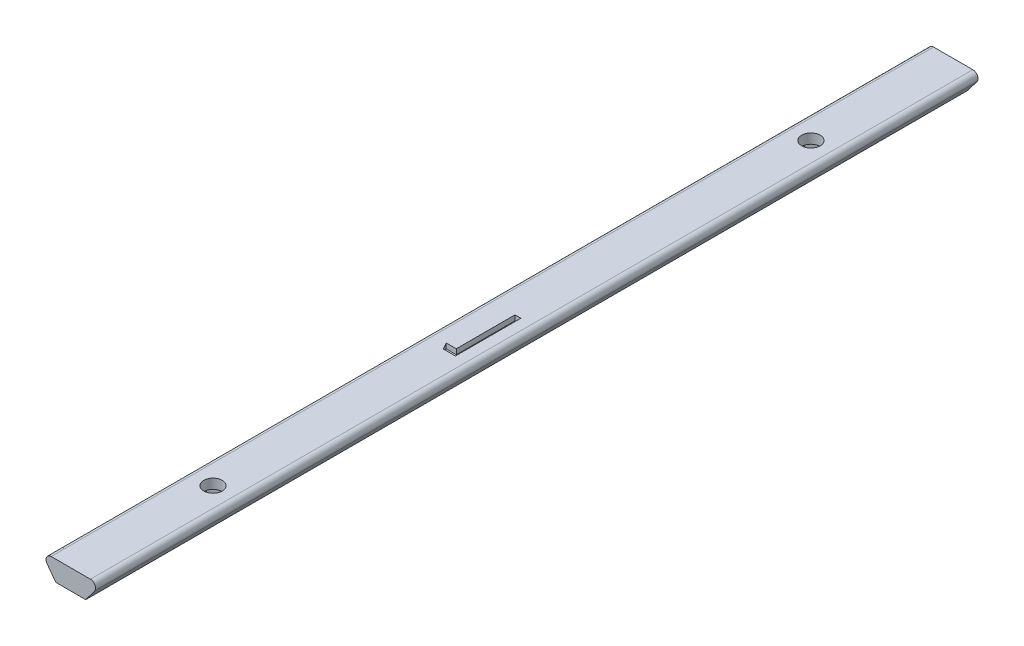
ISO-10303-21;
HEADER;
FILE_DESCRIPTION(('STEP AP214'),'2;1');
FILE_NAME('part.step','',(''),(''),'','','');
FILE_SCHEMA(('AUTOMOTIVE_DESIGN { 1 0 10303 214 1 1 1 1 }'));
ENDSEC;
DATA;
#1=APPLICATION_CONTEXT('core data for automotive mechanical design processes');
#2=APPLICATION_PROTOCOL_DEFINITION('international standard','automotive_design',2000,#1);
#3=PRODUCT_CONTEXT('',#1,'mechanical');
#4=PRODUCT('Part','Part','',(#3));
#5=PRODUCT_RELATED_PRODUCT_CATEGORY('part','',(#4));
#6=PRODUCT_DEFINITION_FORMATION('','',#4);
#7=PRODUCT_DEFINITION_CONTEXT('part definition',#1,'design');
#8=PRODUCT_DEFINITION('design','',#6,#7);
#9=PRODUCT_DEFINITION_SHAPE('','',#8);
#10=(LENGTH_UNIT() NAMED_UNIT(*) SI_UNIT(.MILLI.,.METRE.));
#11=(NAMED_UNIT(*) PLANE_ANGLE_UNIT() SI_UNIT($,.RADIAN.));
#12=(NAMED_UNIT(*) SI_UNIT($,.STERADIAN.) SOLID_ANGLE_UNIT());
#13=UNCERTAINTY_MEASURE_WITH_UNIT(LENGTH_MEASURE(1.E-05),#10,'distance_accuracy_value','');
#14=(GEOMETRIC_REPRESENTATION_CONTEXT(3) GLOBAL_UNCERTAINTY_ASSIGNED_CONTEXT((#13)) GLOBAL_UNIT_ASSIGNED_CONTEXT((#10,
#11,#12)) REPRESENTATION_CONTEXT('',''));
#15=CARTESIAN_POINT('',(0.,0.,0.));
#16=DIRECTION('',(0.,0.,1.));
#17=DIRECTION('',(1.,0.,0.));
#18=AXIS2_PLACEMENT_3D('',#15,#16,#17);
#19=CARTESIAN_POINT('',(0.,0.,171.2));
#20=DIRECTION('',(0.,1.,0.));
#21=DIRECTION('',(0.,0.,1.));
#22=AXIS2_PLACEMENT_3D('',#19,#20,#21);
#23=PLANE('',#22);
#24=DIRECTION('',(0.,0.,-1.));
#25=VECTOR('',#24,1.);
#26=CARTESIAN_POINT('',(5.8,0.,171.2));
#27=LINE('',#26,#25);
#28=CARTESIAN_POINT('',(5.8,0.,27.5875535955502));
#29=VERTEX_POINT('',#28);
#30=CARTESIAN_POINT('',(5.8,0.,0.));
#31=VERTEX_POINT('',#30);
#32=EDGE_CURVE('E390',#29,#31,#27,.T.);
#33=ORIENTED_EDGE('',*,*,#32,.F.);
#34=DIRECTION('',(0.00858356912603264,0.,0.999963160491955));
#35=VECTOR('',#34,1.);
#36=CARTESIAN_POINT('',(5.78552156018468,0.,25.9008535498542));
#37=LINE('',#36,#35);
#38=CARTESIAN_POINT('',(5.78552156018468,0.,25.9008535498542));
#39=VERTEX_POINT('',#38);
#40=EDGE_CURVE('E58',#39,#29,#37,.T.);
#41=ORIENTED_EDGE('',*,*,#40,.F.);
#42=DIRECTION('',(0.870285284397626,0.,0.492547991327691));
#43=VECTOR('',#42,1.);
#44=CARTESIAN_POINT('',(2.871256789516,0.,24.2514918006395));
#45=LINE('',#44,#43);
#46=CARTESIAN_POINT('',(2.871256789516,0.,24.2514918006395));
#47=VERTEX_POINT('',#46);
#48=EDGE_CURVE('E302',#47,#39,#45,.T.);
#49=ORIENTED_EDGE('',*,*,#48,.F.);
#50=DIRECTION('',(0.861701715271594,0.,-0.507415169164259));
#51=VECTOR('',#50,1.);
#52=CARTESIAN_POINT('',(-0.0142647706686716,0.,25.9506382507852));
#53=LINE('',#52,#51);
#54=CARTESIAN_POINT('',(0.,0.,25.9422384055794));
#55=VERTEX_POINT('',#54);
#56=EDGE_CURVE('E300',#55,#47,#53,.T.);
#57=ORIENTED_EDGE('',*,*,#56,.F.);
#58=DIRECTION('',(0.,0.,-1.));
#59=VECTOR('',#58,1.);
#60=CARTESIAN_POINT('',(0.,0.,171.2));
#61=LINE('',#60,#59);
#62=CARTESIAN_POINT('',(0.,0.,0.));
#63=VERTEX_POINT('',#62);
#64=EDGE_CURVE('E405',#55,#63,#61,.T.);
#65=ORIENTED_EDGE('',*,*,#64,.T.);
#66=DIRECTION('',(1.,0.,0.));
#67=VECTOR('',#66,1.);
#68=CARTESIAN_POINT('',(0.,0.,0.));
#69=LINE('',#68,#67);
#70=EDGE_CURVE('E394',#63,#31,#69,.T.);
#71=ORIENTED_EDGE('',*,*,#70,.T.);
#72=EDGE_LOOP('',(#33,#41,#49,#57,#65,#71));
#73=FACE_BOUND('',#72,.T.);
#74=ADVANCED_FACE('F35',(#73),#23,.F.);
#75=CARTESIAN_POINT('',(2.9,200.,27.6));
#76=DIRECTION('',(0.,-1.,0.));
#77=DIRECTION('',(0.,0.,-1.));
#78=AXIS2_PLACEMENT_3D('',#75,#76,#77);
#79=CYLINDRICAL_SURFACE('',#78,1.8);
#80=CARTESIAN_POINT('',(2.9,3.89999999999999,27.6));
#81=DIRECTION('',(0.,-1.,0.));
#82=DIRECTION('',(0.,0.,-1.));
#83=AXIS2_PLACEMENT_3D('',#80,#81,#82);
#84=CIRCLE('',#83,1.8);
#85=CARTESIAN_POINT('',(2.9,3.89999999999999,25.8));
#86=VERTEX_POINT('',#85);
#87=EDGE_CURVE('E345',#86,#86,#84,.T.);
#88=ORIENTED_EDGE('',*,*,#87,.F.);
#89=EDGE_LOOP('',(#88));
#90=FACE_BOUND('',#89,.T.);
#91=CARTESIAN_POINT('',(2.9,2.,27.6));
#92=DIRECTION('',(0.,-1.,0.));
#93=DIRECTION('',(0.,0.,-1.));
#94=AXIS2_PLACEMENT_3D('',#91,#92,#93);
#95=CIRCLE('',#94,1.8);
#96=CARTESIAN_POINT('',(2.9,2.,25.8));
#97=VERTEX_POINT('',#96);
#98=EDGE_CURVE('E309',#97,#97,#95,.F.);
#99=ORIENTED_EDGE('',*,*,#98,.F.);
#100=EDGE_LOOP('',(#99));
#101=FACE_BOUND('',#100,.T.);
#102=ADVANCED_FACE('F537',(#90,#101),#79,.F.);
#103=DIRECTION('',(-0.870285284397629,0.,-0.492547991327686));
#104=VECTOR('',#103,1.);
#105=CARTESIAN_POINT('',(2.92874321048403,0.,30.9485081993604));
#106=LINE('',#105,#104);
#107=CARTESIAN_POINT('',(2.92874321048403,0.,30.9485081993604));
#108=VERTEX_POINT('',#107);
#109=CARTESIAN_POINT('',(0.0144784398153608,0.,29.2991464501457));
#110=VERTEX_POINT('',#109);
#111=EDGE_CURVE('E295',#108,#110,#106,.T.);
#112=ORIENTED_EDGE('',*,*,#111,.F.);
#113=DIRECTION('',(-0.861701715271594,0.,0.507415169164257));
#114=VECTOR('',#113,1.);
#115=CARTESIAN_POINT('',(5.81426477066871,0.,29.2493617492147));
#116=LINE('',#115,#114);
#117=CARTESIAN_POINT('',(5.8,0.,29.2577615944206));
#118=VERTEX_POINT('',#117);
#119=EDGE_CURVE('E267',#118,#108,#116,.T.);
#120=ORIENTED_EDGE('',*,*,#119,.F.);
#121=CARTESIAN_POINT('',(5.8,0.,143.587553595503));
#122=VERTEX_POINT('',#121);
#123=EDGE_CURVE('E406',#122,#118,#27,.T.);
#124=ORIENTED_EDGE('',*,*,#123,.F.);
#125=DIRECTION('',(0.00858356912603264,0.,0.999963160491955));
#126=VECTOR('',#125,1.);
#127=CARTESIAN_POINT('',(5.78552156018468,0.,141.900853549854));
#128=LINE('',#127,#126);
#129=CARTESIAN_POINT('',(5.78552156018468,0.,141.900853549854));
#130=VERTEX_POINT('',#129);
#131=EDGE_CURVE('E326',#130,#122,#128,.T.);
#132=ORIENTED_EDGE('',*,*,#131,.F.);
#133=DIRECTION('',(0.870285284397626,0.,0.492547991327691));
#134=VECTOR('',#133,1.);
#135=CARTESIAN_POINT('',(2.871256789516,0.,140.25149180064));
#136=LINE('',#135,#134);
#137=CARTESIAN_POINT('',(2.871256789516,0.,140.25149180064));
#138=VERTEX_POINT('',#137);
#139=EDGE_CURVE('E352',#138,#130,#136,.T.);
#140=ORIENTED_EDGE('',*,*,#139,.F.);
#141=DIRECTION('',(0.861701715271594,0.,-0.507415169164259));
#142=VECTOR('',#141,1.);
#143=CARTESIAN_POINT('',(-0.0142647706686716,0.,141.950638250785));
#144=LINE('',#143,#142);
#145=CARTESIAN_POINT('',(0.,0.,141.942238405579));
#146=VERTEX_POINT('',#145);
#147=EDGE_CURVE('E350',#146,#138,#144,.T.);
#148=ORIENTED_EDGE('',*,*,#147,.F.);
#149=CARTESIAN_POINT('',(3.05716128817411E-12,0.,27.6124464052033));
#150=VERTEX_POINT('',#149);
#151=EDGE_CURVE('E411',#146,#150,#61,.T.);
#152=ORIENTED_EDGE('',*,*,#151,.T.);
#153=DIRECTION('',(-0.00858356912603282,0.,-0.999963160491955));
#154=VECTOR('',#153,1.);
#155=CARTESIAN_POINT('',(0.0144784398153608,0.,29.2991464501457));
#156=LINE('',#155,#154);
#157=EDGE_CURVE('E298',#110,#150,#156,.T.);
#158=ORIENTED_EDGE('',*,*,#157,.F.);
#159=EDGE_LOOP('',(#112,#120,#124,#132,#140,#148,#152,#158));
#160=FACE_BOUND('',#159,.T.);
#161=ADVANCED_FACE('F458',(#160),#23,.F.);
#162=CARTESIAN_POINT('',(2.9,200.,143.6));
#163=DIRECTION('',(0.,-1.,0.));
#164=DIRECTION('',(0.,0.,-1.));
#165=AXIS2_PLACEMENT_3D('',#162,#163,#164);
#166=CYLINDRICAL_SURFACE('',#165,1.8);
#167=CARTESIAN_POINT('',(2.9,3.89999999999999,143.6));
#168=DIRECTION('',(0.,-1.,0.));
#169=DIRECTION('',(0.,0.,-1.));
#170=AXIS2_PLACEMENT_3D('',#167,#168,#169);
#171=CIRCLE('',#170,1.8);
#172=CARTESIAN_POINT('',(2.9,3.89999999999999,141.8));
#173=VERTEX_POINT('',#172);
#174=EDGE_CURVE('E378',#173,#173,#171,.T.);
#175=ORIENTED_EDGE('',*,*,#174,.F.);
#176=EDGE_LOOP('',(#175));
#177=FACE_BOUND('',#176,.T.);
#178=CARTESIAN_POINT('',(2.9,2.,143.6));
#179=DIRECTION('',(0.,-1.,0.));
#180=DIRECTION('',(0.,0.,-1.));
#181=AXIS2_PLACEMENT_3D('',#178,#179,#180);
#182=CIRCLE('',#181,1.8);
#183=CARTESIAN_POINT('',(2.9,2.,141.8));
#184=VERTEX_POINT('',#183);
#185=EDGE_CURVE('E359',#184,#184,#182,.F.);
#186=ORIENTED_EDGE('',*,*,#185,.F.);
#187=EDGE_LOOP('',(#186));
#188=FACE_BOUND('',#187,.T.);
#189=ADVANCED_FACE('F547',(#177,#188),#166,.F.);
#190=CARTESIAN_POINT('',(0.,0.,171.2));
#191=DIRECTION('',(0.802462340946133,0.596702766344561,0.));
#192=DIRECTION('',(-0.596702766344561,0.802462340946133,0.));
#193=AXIS2_PLACEMENT_3D('',#190,#191,#192);
#194=PLANE('',#193);
#195=ORIENTED_EDGE('',*,*,#64,.F.);
#196=DIRECTION('',(-0.562962011585091,0.757086843166157,0.331501561710907));
#197=VECTOR('',#196,1.);
#198=CARTESIAN_POINT('',(-27.1084081604147,36.4561351122819,41.9050910594761));
#199=LINE('',#198,#197);
#200=CARTESIAN_POINT('',(-0.0142647706686716,0.0191836571061453,25.9506382507852));
#201=VERTEX_POINT('',#200);
#202=EDGE_CURVE('E11',#55,#201,#199,.T.);
#203=ORIENTED_EDGE('',*,*,#202,.T.);
#204=DIRECTION('',(0.00858299730049154,-0.0115426515420404,0.999896544324821));
#205=VECTOR('',#204,1.);
#206=CARTESIAN_POINT('',(1.23228408492183,-1.65720963144659,171.17029164222));
#207=LINE('',#206,#205);
#208=EDGE_CURVE('E43',#201,#150,#207,.T.);
#209=ORIENTED_EDGE('',*,*,#208,.T.);
#210=ORIENTED_EDGE('',*,*,#151,.F.);
#211=DIRECTION('',(-0.562962011585091,0.757086843166157,0.331501561710907));
#212=VECTOR('',#211,1.);
#213=CARTESIAN_POINT('',(-5.46016498158763,7.34298049247992,145.157469951131));
#214=LINE('',#213,#212);
#215=CARTESIAN_POINT('',(-0.0142647706686715,0.0191836571061445,141.950638250785));
#216=VERTEX_POINT('',#215);
#217=EDGE_CURVE('E375',#146,#216,#214,.T.);
#218=ORIENTED_EDGE('',*,*,#217,.T.);
#219=DIRECTION('',(0.00858299730049154,-0.0115426515420404,0.999896544324821));
#220=VECTOR('',#219,1.);
#221=CARTESIAN_POINT('',(0.236759401399377,-0.318400574295714,171.194292117304));
#222=LINE('',#221,#220);
#223=CARTESIAN_POINT('',(0.,0.,143.612446404491));
#224=VERTEX_POINT('',#223);
#225=EDGE_CURVE('E372',#216,#224,#222,.T.);
#226=ORIENTED_EDGE('',*,*,#225,.T.);
#227=CARTESIAN_POINT('',(0.,0.,171.2));
#228=VERTEX_POINT('',#227);
#229=EDGE_CURVE('E407',#228,#224,#61,.T.);
#230=ORIENTED_EDGE('',*,*,#229,.F.);
#231=DIRECTION('',(0.596702766344561,-0.802462340946133,0.));
#232=VECTOR('',#231,1.);
#233=CARTESIAN_POINT('',(0.,0.,171.2));
#234=LINE('',#233,#232);
#235=CARTESIAN_POINT('',(-1.71270819938481,2.30329723365544,171.2));
#236=VERTEX_POINT('',#235);
#237=EDGE_CURVE('E379',#236,#228,#234,.T.);
#238=ORIENTED_EDGE('',*,*,#237,.F.);
#239=DIRECTION('',(0.,0.,-1.));
#240=VECTOR('',#239,1.);
#241=CARTESIAN_POINT('',(-1.71270819938481,2.30329723365544,171.2));
#242=LINE('',#241,#240);
#243=CARTESIAN_POINT('',(-1.71270819938481,2.30329723365544,0.));
#244=VERTEX_POINT('',#243);
#245=EDGE_CURVE('E410',#236,#244,#242,.T.);
#246=ORIENTED_EDGE('',*,*,#245,.T.);
#247=DIRECTION('',(0.596702766344561,-0.802462340946133,0.));
#248=VECTOR('',#247,1.);
#249=CARTESIAN_POINT('',(0.,0.,0.));
#250=LINE('',#249,#248);
#251=EDGE_CURVE('E391',#244,#63,#250,.T.);
#252=ORIENTED_EDGE('',*,*,#251,.T.);
#253=EDGE_LOOP('',(#195,#203,#209,#210,#218,#226,#230,#238,#246,#252));
#254=FACE_BOUND('',#253,.T.);
#255=ADVANCED_FACE('F452',(#254),#194,.F.);
#256=DIRECTION('',(-0.870285284397629,0.,-0.492547991327686));
#257=VECTOR('',#256,1.);
#258=CARTESIAN_POINT('',(2.92874321048403,0.,146.94850819936));
#259=LINE('',#258,#257);
#260=CARTESIAN_POINT('',(2.92874321048403,0.,146.94850819936));
#261=VERTEX_POINT('',#260);
#262=CARTESIAN_POINT('',(0.0144784398153608,0.,145.299146450146));
#263=VERTEX_POINT('',#262);
#264=EDGE_CURVE('E344',#261,#263,#259,.T.);
#265=ORIENTED_EDGE('',*,*,#264,.F.);
#266=DIRECTION('',(-0.861701715271594,0.,0.507415169164257));
#267=VECTOR('',#266,1.);
#268=CARTESIAN_POINT('',(5.81426477066871,0.,145.249361749215));
#269=LINE('',#268,#267);
#270=CARTESIAN_POINT('',(5.8,0.,145.257761594421));
#271=VERTEX_POINT('',#270);
#272=EDGE_CURVE('E342',#271,#261,#269,.T.);
#273=ORIENTED_EDGE('',*,*,#272,.F.);
#274=CARTESIAN_POINT('',(5.8,0.,171.2));
#275=VERTEX_POINT('',#274);
#276=EDGE_CURVE('E402',#275,#271,#27,.T.);
#277=ORIENTED_EDGE('',*,*,#276,.F.);
#278=DIRECTION('',(1.,0.,0.));
#279=VECTOR('',#278,1.);
#280=CARTESIAN_POINT('',(0.,0.,171.2));
#281=LINE('',#280,#279);
#282=EDGE_CURVE('E381',#228,#275,#281,.T.);
#283=ORIENTED_EDGE('',*,*,#282,.F.);
#284=ORIENTED_EDGE('',*,*,#229,.T.);
#285=DIRECTION('',(-0.00858356912603282,0.,-0.999963160491955));
#286=VECTOR('',#285,1.);
#287=CARTESIAN_POINT('',(0.0144784398153608,0.,145.299146450146));
#288=LINE('',#287,#286);
#289=EDGE_CURVE('E348',#263,#224,#288,.T.);
#290=ORIENTED_EDGE('',*,*,#289,.F.);
#291=EDGE_LOOP('',(#265,#273,#277,#283,#284,#290));
#292=FACE_BOUND('',#291,.T.);
#293=ADVANCED_FACE('F494',(#292),#23,.F.);
#294=CARTESIAN_POINT('',(5.8,0.,171.2));
#295=DIRECTION('',(-0.802462340946134,0.596702766344561,0.));
#296=DIRECTION('',(-0.596702766344561,-0.802462340946134,0.));
#297=AXIS2_PLACEMENT_3D('',#294,#295,#296);
#298=PLANE('',#297);
#299=ORIENTED_EDGE('',*,*,#123,.T.);
#300=DIRECTION('',(0.562962011585091,0.757086843166157,-0.331501561710906));
#301=VECTOR('',#300,1.);
#302=CARTESIAN_POINT('',(-20.6896559857847,-35.6240201188139,44.8562605122201));
#303=LINE('',#302,#301);
#304=CARTESIAN_POINT('',(5.81426477066871,0.0191836571062012,29.2493617492147));
#305=VERTEX_POINT('',#304);
#306=EDGE_CURVE('E445',#118,#305,#303,.T.);
#307=ORIENTED_EDGE('',*,*,#306,.T.);
#308=DIRECTION('',(-0.00858299730049137,-0.0115426515420401,-0.999896544324821));
#309=VECTOR('',#308,1.);
#310=CARTESIAN_POINT('',(7.03249771773032,1.65749693074078,171.170286491881));
#311=LINE('',#310,#309);
#312=EDGE_CURVE('E439',#305,#29,#311,.T.);
#313=ORIENTED_EDGE('',*,*,#312,.T.);
#314=ORIENTED_EDGE('',*,*,#32,.T.);
#315=DIRECTION('',(0.596702766344561,0.802462340946133,0.));
#316=VECTOR('',#315,1.);
#317=CARTESIAN_POINT('',(5.8,0.,0.));
#318=LINE('',#317,#316);
#319=CARTESIAN_POINT('',(7.51270819938481,2.30329723365544,0.));
#320=VERTEX_POINT('',#319);
#321=EDGE_CURVE('E397',#31,#320,#318,.T.);
#322=ORIENTED_EDGE('',*,*,#321,.T.);
#323=DIRECTION('',(0.,0.,-1.));
#324=VECTOR('',#323,1.);
#325=CARTESIAN_POINT('',(7.51270819938481,2.30329723365544,171.2));
#326=LINE('',#325,#324);
#327=CARTESIAN_POINT('',(7.51270819938481,2.30329723365544,171.2));
#328=VERTEX_POINT('',#327);
#329=EDGE_CURVE('E427',#320,#328,#326,.F.);
#330=ORIENTED_EDGE('',*,*,#329,.T.);
#331=DIRECTION('',(0.596702766344561,0.802462340946133,0.));
#332=VECTOR('',#331,1.);
#333=CARTESIAN_POINT('',(5.8,0.,171.2));
#334=LINE('',#333,#332);
#335=EDGE_CURVE('E384',#275,#328,#334,.T.);
#336=ORIENTED_EDGE('',*,*,#335,.F.);
#337=ORIENTED_EDGE('',*,*,#276,.T.);
#338=DIRECTION('',(0.562962011585091,0.757086843166157,-0.331501561710906));
#339=VECTOR('',#338,1.);
#340=CARTESIAN_POINT('',(0.958587193042347,-6.51086549901202,148.108639403875));
#341=LINE('',#340,#339);
#342=CARTESIAN_POINT('',(5.81426477066871,0.0191836571062013,145.249361749215));
#343=VERTEX_POINT('',#342);
#344=EDGE_CURVE('E436',#271,#343,#341,.T.);
#345=ORIENTED_EDGE('',*,*,#344,.T.);
#346=DIRECTION('',(-0.00858299730049137,-0.0115426515420401,-0.999896544324821));
#347=VECTOR('',#346,1.);
#348=CARTESIAN_POINT('',(6.03697303420789,0.318687873589927,171.194286966966));
#349=LINE('',#348,#347);
#350=EDGE_CURVE('E429',#343,#122,#349,.T.);
#351=ORIENTED_EDGE('',*,*,#350,.T.);
#352=EDGE_LOOP('',(#299,#307,#313,#314,#322,#330,#336,#337,#345,#351));
#353=FACE_BOUND('',#352,.T.);
#354=ADVANCED_FACE('F475',(#353),#298,.F.);
#355=CARTESIAN_POINT('',(-2.9,3.9,171.2));
#356=DIRECTION('',(0.,-1.,0.));
#357=DIRECTION('',(0.,0.,-1.));
#358=AXIS2_PLACEMENT_3D('',#355,#356,#357);
#359=PLANE('',#358);
#360=DIRECTION('',(1.,0.,0.));
#361=VECTOR('',#360,1.);
#362=CARTESIAN_POINT('',(2.27747449412542,3.90000000000009,98.3));
#363=LINE('',#362,#361);
#364=CARTESIAN_POINT('',(2.27747449412542,3.9,98.3));
#365=VERTEX_POINT('',#364);
#366=CARTESIAN_POINT('',(4.62565157745876,3.90000000000009,98.3));
#367=VERTEX_POINT('',#366);
#368=EDGE_CURVE('E255',#365,#367,#363,.T.);
#369=ORIENTED_EDGE('',*,*,#368,.F.);
#370=DIRECTION('',(0.496686511837685,0.,0.867930013859708));
#371=VECTOR('',#370,1.);
#372=CARTESIAN_POINT('',(1.53206183386901,3.90000000000008,96.9974358974359));
#373=LINE('',#372,#371);
#374=CARTESIAN_POINT('',(1.53206183386901,3.90000000000008,96.9974358974359));
#375=VERTEX_POINT('',#374);
#376=EDGE_CURVE('E50',#375,#365,#373,.T.);
#377=ORIENTED_EDGE('',*,*,#376,.F.);
#378=DIRECTION('',(-1.,0.,0.));
#379=VECTOR('',#378,1.);
#380=CARTESIAN_POINT('',(3.48590798771517,3.90000000000008,96.9974358974359));
#381=LINE('',#380,#379);
#382=CARTESIAN_POINT('',(3.48590798771517,3.90000000000008,96.9974358974359));
#383=VERTEX_POINT('',#382);
#384=EDGE_CURVE('E241',#383,#375,#381,.T.);
#385=ORIENTED_EDGE('',*,*,#384,.F.);
#386=DIRECTION('',(0.,0.,1.));
#387=VECTOR('',#386,1.);
#388=CARTESIAN_POINT('',(3.48590798771517,3.9,85.6));
#389=LINE('',#388,#387);
#390=CARTESIAN_POINT('',(3.48590798771517,3.9,85.6));
#391=VERTEX_POINT('',#390);
#392=EDGE_CURVE('E244',#391,#383,#389,.T.);
#393=ORIENTED_EDGE('',*,*,#392,.F.);
#394=DIRECTION('',(-1.,0.,0.));
#395=VECTOR('',#394,1.);
#396=CARTESIAN_POINT('',(4.62565157745876,3.9,85.6));
#397=LINE('',#396,#395);
#398=CARTESIAN_POINT('',(4.62565157745876,3.9,85.6));
#399=VERTEX_POINT('',#398);
#400=EDGE_CURVE('E260',#399,#391,#397,.T.);
#401=ORIENTED_EDGE('',*,*,#400,.F.);
#402=DIRECTION('',(0.,0.,-1.));
#403=VECTOR('',#402,1.);
#404=CARTESIAN_POINT('',(4.62565157745876,3.90000000000009,98.3));
#405=LINE('',#404,#403);
#406=EDGE_CURVE('E257',#367,#399,#405,.T.);
#407=ORIENTED_EDGE('',*,*,#406,.F.);
#408=EDGE_LOOP('',(#369,#377,#385,#393,#401,#407));
#409=FACE_BOUND('',#408,.T.);
#410=ORIENTED_EDGE('',*,*,#87,.T.);
#411=EDGE_LOOP('',(#410));
#412=FACE_BOUND('',#411,.T.);
#413=ORIENTED_EDGE('',*,*,#174,.T.);
#414=EDGE_LOOP('',(#413));
#415=FACE_BOUND('',#414,.T.);
#416=DIRECTION('',(-1.,0.,0.));
#417=VECTOR('',#416,1.);
#418=CARTESIAN_POINT('',(-2.9,3.9,0.));
#419=LINE('',#418,#417);
#420=CARTESIAN_POINT('',(6.71024585843868,3.9,0.));
#421=VERTEX_POINT('',#420);
#422=CARTESIAN_POINT('',(-0.91024585843868,3.9,0.));
#423=VERTEX_POINT('',#422);
#424=EDGE_CURVE('E382',#421,#423,#419,.T.);
#425=ORIENTED_EDGE('',*,*,#424,.T.);
#426=DIRECTION('',(0.,0.,-1.));
#427=VECTOR('',#426,1.);
#428=CARTESIAN_POINT('',(-0.91024585843868,3.9,171.2));
#429=LINE('',#428,#427);
#430=CARTESIAN_POINT('',(-0.91024585843868,3.9,171.2));
#431=VERTEX_POINT('',#430);
#432=EDGE_CURVE('E421',#423,#431,#429,.F.);
#433=ORIENTED_EDGE('',*,*,#432,.T.);
#434=DIRECTION('',(-1.,0.,0.));
#435=VECTOR('',#434,1.);
#436=CARTESIAN_POINT('',(-2.9,3.9,171.2));
#437=LINE('',#436,#435);
#438=CARTESIAN_POINT('',(6.71024585843868,3.9,171.2));
#439=VERTEX_POINT('',#438);
#440=EDGE_CURVE('E387',#439,#431,#437,.T.);
#441=ORIENTED_EDGE('',*,*,#440,.F.);
#442=DIRECTION('',(0.,0.,-1.));
#443=VECTOR('',#442,1.);
#444=CARTESIAN_POINT('',(6.71024585843868,3.9,171.2));
#445=LINE('',#444,#443);
#446=EDGE_CURVE('E418',#439,#421,#445,.T.);
#447=ORIENTED_EDGE('',*,*,#446,.T.);
#448=EDGE_LOOP('',(#425,#433,#441,#447));
#449=FACE_BOUND('',#448,.T.);
#450=ADVANCED_FACE('F485',(#409,#412,#415,#449),#359,.F.);
#451=CARTESIAN_POINT('',(0.,0.,171.2));
#452=DIRECTION('',(0.,0.,-1.));
#453=DIRECTION('',(-1.,0.,0.));
#454=AXIS2_PLACEMENT_3D('',#451,#452,#453);
#455=PLANE('',#454);
#456=ORIENTED_EDGE('',*,*,#440,.T.);
#457=CARTESIAN_POINT('',(-0.91024585843868,2.9,171.2));
#458=DIRECTION('',(0.,0.,-1.));
#459=DIRECTION('',(-1.,0.,0.));
#460=AXIS2_PLACEMENT_3D('',#457,#458,#459);
#461=CIRCLE('',#460,1.);
#462=EDGE_CURVE('E425',#431,#236,#461,.F.);
#463=ORIENTED_EDGE('',*,*,#462,.T.);
#464=ORIENTED_EDGE('',*,*,#237,.T.);
#465=ORIENTED_EDGE('',*,*,#282,.T.);
#466=ORIENTED_EDGE('',*,*,#335,.T.);
#467=CARTESIAN_POINT('',(6.71024585843868,2.9,171.2));
#468=DIRECTION('',(0.,0.,-1.));
#469=DIRECTION('',(-1.,0.,0.));
#470=AXIS2_PLACEMENT_3D('',#467,#468,#469);
#471=CIRCLE('',#470,1.);
#472=EDGE_CURVE('E423',#328,#439,#471,.F.);
#473=ORIENTED_EDGE('',*,*,#472,.T.);
#474=EDGE_LOOP('',(#456,#463,#464,#465,#466,#473));
#475=FACE_BOUND('',#474,.T.);
#476=ADVANCED_FACE('F482',(#475),#455,.F.);
#477=CARTESIAN_POINT('',(0.,0.,0.));
#478=DIRECTION('',(0.,0.,-1.));
#479=DIRECTION('',(-1.,0.,0.));
#480=AXIS2_PLACEMENT_3D('',#477,#478,#479);
#481=PLANE('',#480);
#482=ORIENTED_EDGE('',*,*,#251,.F.);
#483=CARTESIAN_POINT('',(-0.91024585843868,2.9,0.));
#484=DIRECTION('',(0.,0.,-1.));
#485=DIRECTION('',(-1.,0.,0.));
#486=AXIS2_PLACEMENT_3D('',#483,#484,#485);
#487=CIRCLE('',#486,1.);
#488=EDGE_CURVE('E416',#244,#423,#487,.T.);
#489=ORIENTED_EDGE('',*,*,#488,.T.);
#490=ORIENTED_EDGE('',*,*,#424,.F.);
#491=CARTESIAN_POINT('',(6.71024585843868,2.9,0.));
#492=DIRECTION('',(0.,0.,-1.));
#493=DIRECTION('',(-1.,0.,0.));
#494=AXIS2_PLACEMENT_3D('',#491,#492,#493);
#495=CIRCLE('',#494,1.);
#496=EDGE_CURVE('E414',#421,#320,#495,.T.);
#497=ORIENTED_EDGE('',*,*,#496,.T.);
#498=ORIENTED_EDGE('',*,*,#321,.F.);
#499=ORIENTED_EDGE('',*,*,#70,.F.);
#500=EDGE_LOOP('',(#482,#489,#490,#497,#498,#499));
#501=FACE_BOUND('',#500,.T.);
#502=ADVANCED_FACE('F470',(#501),#481,.T.);
#503=CARTESIAN_POINT('',(-0.91024585843868,2.9,171.2));
#504=DIRECTION('',(0.,0.,-1.));
#505=DIRECTION('',(-1.,0.,0.));
#506=AXIS2_PLACEMENT_3D('',#503,#504,#505);
#507=CYLINDRICAL_SURFACE('',#506,1.);
#508=ORIENTED_EDGE('',*,*,#462,.F.);
#509=ORIENTED_EDGE('',*,*,#432,.F.);
#510=ORIENTED_EDGE('',*,*,#488,.F.);
#511=ORIENTED_EDGE('',*,*,#245,.F.);
#512=EDGE_LOOP('',(#508,#509,#510,#511));
#513=FACE_BOUND('',#512,.T.);
#514=ADVANCED_FACE('F488',(#513),#507,.T.);
#515=CARTESIAN_POINT('',(6.71024585843868,2.9,171.2));
#516=DIRECTION('',(0.,0.,-1.));
#517=DIRECTION('',(-1.,0.,0.));
#518=AXIS2_PLACEMENT_3D('',#515,#516,#517);
#519=CYLINDRICAL_SURFACE('',#518,1.);
#520=ORIENTED_EDGE('',*,*,#472,.F.);
#521=ORIENTED_EDGE('',*,*,#329,.F.);
#522=ORIENTED_EDGE('',*,*,#496,.F.);
#523=ORIENTED_EDGE('',*,*,#446,.F.);
#524=EDGE_LOOP('',(#520,#521,#522,#523));
#525=FACE_BOUND('',#524,.T.);
#526=ADVANCED_FACE('F37',(#525),#519,.T.);
#527=CARTESIAN_POINT('',(-0.0142647706686716,2.,141.950638250785));
#528=DIRECTION('',(-0.507415169164259,0.,-0.861701715271594));
#529=DIRECTION('',(-0.861701715271594,0.,0.507415169164259));
#530=AXIS2_PLACEMENT_3D('',#527,#528,#529);
#531=PLANE('',#530);
#532=ORIENTED_EDGE('',*,*,#147,.T.);
#533=DIRECTION('',(0.,-1.,0.));
#534=VECTOR('',#533,1.);
#535=CARTESIAN_POINT('',(2.871256789516,2.,140.25149180064));
#536=LINE('',#535,#534);
#537=CARTESIAN_POINT('',(2.871256789516,2.,140.25149180064));
#538=VERTEX_POINT('',#537);
#539=EDGE_CURVE('E362',#538,#138,#536,.T.);
#540=ORIENTED_EDGE('',*,*,#539,.F.);
#541=DIRECTION('',(0.861701715271594,0.,-0.507415169164259));
#542=VECTOR('',#541,1.);
#543=CARTESIAN_POINT('',(-0.0142647706686716,2.,141.950638250785));
#544=LINE('',#543,#542);
#545=CARTESIAN_POINT('',(-0.0142647706686716,2.,141.950638250785));
#546=VERTEX_POINT('',#545);
#547=EDGE_CURVE('E332',#546,#538,#544,.T.);
#548=ORIENTED_EDGE('',*,*,#547,.F.);
#549=DIRECTION('',(0.,-1.,0.));
#550=VECTOR('',#549,1.);
#551=CARTESIAN_POINT('',(-0.0142647706686716,2.,141.950638250785));
#552=LINE('',#551,#550);
#553=EDGE_CURVE('E365',#546,#216,#552,.T.);
#554=ORIENTED_EDGE('',*,*,#553,.T.);
#555=ORIENTED_EDGE('',*,*,#217,.F.);
#556=EDGE_LOOP('',(#532,#540,#548,#554,#555));
#557=FACE_BOUND('',#556,.T.);
#558=ADVANCED_FACE('F563',(#557),#531,.F.);
#559=CARTESIAN_POINT('',(0.0144784398153608,2.,145.299146450146));
#560=DIRECTION('',(-0.999963160491955,0.,0.00858356912603282));
#561=DIRECTION('',(0.00858356912603282,0.,0.999963160491955));
#562=AXIS2_PLACEMENT_3D('',#559,#560,#561);
#563=PLANE('',#562);
#564=ORIENTED_EDGE('',*,*,#553,.F.);
#565=DIRECTION('',(-0.00858356912603282,0.,-0.999963160491955));
#566=VECTOR('',#565,1.);
#567=CARTESIAN_POINT('',(0.0144784398153608,2.,145.299146450146));
#568=LINE('',#567,#566);
#569=CARTESIAN_POINT('',(0.0144784398153608,2.,145.299146450146));
#570=VERTEX_POINT('',#569);
#571=EDGE_CURVE('E329',#570,#546,#568,.T.);
#572=ORIENTED_EDGE('',*,*,#571,.F.);
#573=DIRECTION('',(0.,-1.,0.));
#574=VECTOR('',#573,1.);
#575=CARTESIAN_POINT('',(0.0144784398153608,2.,145.299146450146));
#576=LINE('',#575,#574);
#577=EDGE_CURVE('E368',#570,#263,#576,.T.);
#578=ORIENTED_EDGE('',*,*,#577,.T.);
#579=ORIENTED_EDGE('',*,*,#289,.T.);
#580=ORIENTED_EDGE('',*,*,#225,.F.);
#581=EDGE_LOOP('',(#564,#572,#578,#579,#580));
#582=FACE_BOUND('',#581,.T.);
#583=ADVANCED_FACE('F598',(#582),#563,.F.);
#584=CARTESIAN_POINT('',(5.81426477066871,2.,145.249361749215));
#585=DIRECTION('',(0.507415169164257,0.,0.861701715271594));
#586=DIRECTION('',(0.861701715271594,0.,-0.507415169164257));
#587=AXIS2_PLACEMENT_3D('',#584,#585,#586);
#588=PLANE('',#587);
#589=ORIENTED_EDGE('',*,*,#272,.T.);
#590=DIRECTION('',(0.,-1.,0.));
#591=VECTOR('',#590,1.);
#592=CARTESIAN_POINT('',(2.92874321048403,2.,146.94850819936));
#593=LINE('',#592,#591);
#594=CARTESIAN_POINT('',(2.92874321048403,2.,146.94850819936));
#595=VERTEX_POINT('',#594);
#596=EDGE_CURVE('E341',#595,#261,#593,.T.);
#597=ORIENTED_EDGE('',*,*,#596,.F.);
#598=DIRECTION('',(-0.861701715271594,0.,0.507415169164257));
#599=VECTOR('',#598,1.);
#600=CARTESIAN_POINT('',(5.81426477066871,2.,145.249361749215));
#601=LINE('',#600,#599);
#602=CARTESIAN_POINT('',(5.81426477066871,2.,145.249361749215));
#603=VERTEX_POINT('',#602);
#604=EDGE_CURVE('E322',#603,#595,#601,.T.);
#605=ORIENTED_EDGE('',*,*,#604,.F.);
#606=DIRECTION('',(0.,-1.,0.));
#607=VECTOR('',#606,1.);
#608=CARTESIAN_POINT('',(5.81426477066871,2.,145.249361749215));
#609=LINE('',#608,#607);
#610=EDGE_CURVE('E356',#603,#343,#609,.T.);
#611=ORIENTED_EDGE('',*,*,#610,.T.);
#612=ORIENTED_EDGE('',*,*,#344,.F.);
#613=EDGE_LOOP('',(#589,#597,#605,#611,#612));
#614=FACE_BOUND('',#613,.T.);
#615=ADVANCED_FACE('F499',(#614),#588,.F.);
#616=CARTESIAN_POINT('',(5.78552156018468,2.,141.900853549854));
#617=DIRECTION('',(0.999963160491955,0.,-0.00858356912603264));
#618=DIRECTION('',(-0.00858356912603264,0.,-0.999963160491955));
#619=AXIS2_PLACEMENT_3D('',#616,#617,#618);
#620=PLANE('',#619);
#621=ORIENTED_EDGE('',*,*,#610,.F.);
#622=DIRECTION('',(0.00858356912603264,0.,0.999963160491955));
#623=VECTOR('',#622,1.);
#624=CARTESIAN_POINT('',(5.78552156018468,2.,141.900853549854));
#625=LINE('',#624,#623);
#626=CARTESIAN_POINT('',(5.78552156018468,2.,141.900853549854));
#627=VERTEX_POINT('',#626);
#628=EDGE_CURVE('E338',#627,#603,#625,.T.);
#629=ORIENTED_EDGE('',*,*,#628,.F.);
#630=DIRECTION('',(0.,-1.,0.));
#631=VECTOR('',#630,1.);
#632=CARTESIAN_POINT('',(5.78552156018468,2.,141.900853549854));
#633=LINE('',#632,#631);
#634=EDGE_CURVE('E360',#627,#130,#633,.T.);
#635=ORIENTED_EDGE('',*,*,#634,.T.);
#636=ORIENTED_EDGE('',*,*,#131,.T.);
#637=ORIENTED_EDGE('',*,*,#350,.F.);
#638=EDGE_LOOP('',(#621,#629,#635,#636,#637));
#639=FACE_BOUND('',#638,.T.);
#640=ADVANCED_FACE('F503',(#639),#620,.F.);
#641=CARTESIAN_POINT('',(0.,2.,0.));
#642=DIRECTION('',(0.,-1.,0.));
#643=DIRECTION('',(0.,0.,-1.));
#644=AXIS2_PLACEMENT_3D('',#641,#642,#643);
#645=PLANE('',#644);
#646=ORIENTED_EDGE('',*,*,#604,.T.);
#647=DIRECTION('',(-0.870285284397629,0.,-0.492547991327686));
#648=VECTOR('',#647,1.);
#649=CARTESIAN_POINT('',(2.92874321048403,2.,146.94850819936));
#650=LINE('',#649,#648);
#651=EDGE_CURVE('E325',#595,#570,#650,.T.);
#652=ORIENTED_EDGE('',*,*,#651,.T.);
#653=ORIENTED_EDGE('',*,*,#571,.T.);
#654=ORIENTED_EDGE('',*,*,#547,.T.);
#655=DIRECTION('',(0.870285284397626,0.,0.492547991327691));
#656=VECTOR('',#655,1.);
#657=CARTESIAN_POINT('',(2.871256789516,2.,140.25149180064));
#658=LINE('',#657,#656);
#659=EDGE_CURVE('E335',#538,#627,#658,.T.);
#660=ORIENTED_EDGE('',*,*,#659,.T.);
#661=ORIENTED_EDGE('',*,*,#628,.T.);
#662=EDGE_LOOP('',(#646,#652,#653,#654,#660,#661));
#663=FACE_BOUND('',#662,.T.);
#664=ORIENTED_EDGE('',*,*,#185,.T.);
#665=EDGE_LOOP('',(#664));
#666=FACE_BOUND('',#665,.T.);
#667=ADVANCED_FACE('F582',(#663,#666),#645,.T.);
#668=CARTESIAN_POINT('',(2.871256789516,2.,140.25149180064));
#669=DIRECTION('',(0.492547991327691,0.,-0.870285284397626));
#670=DIRECTION('',(-0.870285284397626,0.,-0.492547991327691));
#671=AXIS2_PLACEMENT_3D('',#668,#669,#670);
#672=PLANE('',#671);
#673=ORIENTED_EDGE('',*,*,#139,.T.);
#674=ORIENTED_EDGE('',*,*,#634,.F.);
#675=ORIENTED_EDGE('',*,*,#659,.F.);
#676=ORIENTED_EDGE('',*,*,#539,.T.);
#677=EDGE_LOOP('',(#673,#674,#675,#676));
#678=FACE_BOUND('',#677,.T.);
#679=ADVANCED_FACE('F584',(#678),#672,.F.);
#680=CARTESIAN_POINT('',(2.92874321048403,2.,146.94850819936));
#681=DIRECTION('',(-0.492547991327686,0.,0.870285284397629));
#682=DIRECTION('',(0.870285284397629,0.,0.492547991327686));
#683=AXIS2_PLACEMENT_3D('',#680,#681,#682);
#684=PLANE('',#683);
#685=ORIENTED_EDGE('',*,*,#264,.T.);
#686=ORIENTED_EDGE('',*,*,#577,.F.);
#687=ORIENTED_EDGE('',*,*,#651,.F.);
#688=ORIENTED_EDGE('',*,*,#596,.T.);
#689=EDGE_LOOP('',(#685,#686,#687,#688));
#690=FACE_BOUND('',#689,.T.);
#691=ADVANCED_FACE('F591',(#690),#684,.F.);
#692=CARTESIAN_POINT('',(-0.0142647706686716,2.,25.9506382507852));
#693=DIRECTION('',(-0.507415169164259,0.,-0.861701715271594));
#694=DIRECTION('',(-0.861701715271594,0.,0.507415169164259));
#695=AXIS2_PLACEMENT_3D('',#692,#693,#694);
#696=PLANE('',#695);
#697=ORIENTED_EDGE('',*,*,#56,.T.);
#698=DIRECTION('',(0.,-1.,0.));
#699=VECTOR('',#698,1.);
#700=CARTESIAN_POINT('',(2.871256789516,2.,24.2514918006395));
#701=LINE('',#700,#699);
#702=CARTESIAN_POINT('',(2.871256789516,2.,24.2514918006395));
#703=VERTEX_POINT('',#702);
#704=EDGE_CURVE('E312',#703,#47,#701,.T.);
#705=ORIENTED_EDGE('',*,*,#704,.F.);
#706=DIRECTION('',(0.861701715271594,0.,-0.507415169164259));
#707=VECTOR('',#706,1.);
#708=CARTESIAN_POINT('',(-0.0142647706686716,2.,25.9506382507852));
#709=LINE('',#708,#707);
#710=CARTESIAN_POINT('',(-0.0142647706686716,2.,25.9506382507852));
#711=VERTEX_POINT('',#710);
#712=EDGE_CURVE('E284',#711,#703,#709,.T.);
#713=ORIENTED_EDGE('',*,*,#712,.F.);
#714=DIRECTION('',(0.,-1.,0.));
#715=VECTOR('',#714,1.);
#716=CARTESIAN_POINT('',(-0.0142647706686716,2.,25.9506382507852));
#717=LINE('',#716,#715);
#718=EDGE_CURVE('E315',#711,#201,#717,.T.);
#719=ORIENTED_EDGE('',*,*,#718,.T.);
#720=ORIENTED_EDGE('',*,*,#202,.F.);
#721=EDGE_LOOP('',(#697,#705,#713,#719,#720));
#722=FACE_BOUND('',#721,.T.);
#723=ADVANCED_FACE('F519',(#722),#696,.F.);
#724=CARTESIAN_POINT('',(0.0144784398153608,2.,29.2991464501457));
#725=DIRECTION('',(-0.999963160491955,0.,0.00858356912603282));
#726=DIRECTION('',(0.00858356912603282,0.,0.999963160491955));
#727=AXIS2_PLACEMENT_3D('',#724,#725,#726);
#728=PLANE('',#727);
#729=ORIENTED_EDGE('',*,*,#718,.F.);
#730=DIRECTION('',(-0.00858356912603282,0.,-0.999963160491955));
#731=VECTOR('',#730,1.);
#732=CARTESIAN_POINT('',(0.0144784398153608,2.,29.2991464501457));
#733=LINE('',#732,#731);
#734=CARTESIAN_POINT('',(0.0144784398153608,2.,29.2991464501457));
#735=VERTEX_POINT('',#734);
#736=EDGE_CURVE('E281',#735,#711,#733,.T.);
#737=ORIENTED_EDGE('',*,*,#736,.F.);
#738=DIRECTION('',(0.,-1.,0.));
#739=VECTOR('',#738,1.);
#740=CARTESIAN_POINT('',(0.0144784398153608,2.,29.2991464501457));
#741=LINE('',#740,#739);
#742=EDGE_CURVE('E318',#735,#110,#741,.T.);
#743=ORIENTED_EDGE('',*,*,#742,.T.);
#744=ORIENTED_EDGE('',*,*,#157,.T.);
#745=ORIENTED_EDGE('',*,*,#208,.F.);
#746=EDGE_LOOP('',(#729,#737,#743,#744,#745));
#747=FACE_BOUND('',#746,.T.);
#748=ADVANCED_FACE('F521',(#747),#728,.F.);
#749=CARTESIAN_POINT('',(5.81426477066871,2.,29.2493617492147));
#750=DIRECTION('',(0.507415169164257,0.,0.861701715271594));
#751=DIRECTION('',(0.861701715271594,0.,-0.507415169164257));
#752=AXIS2_PLACEMENT_3D('',#749,#750,#751);
#753=PLANE('',#752);
#754=ORIENTED_EDGE('',*,*,#119,.T.);
#755=DIRECTION('',(0.,-1.,0.));
#756=VECTOR('',#755,1.);
#757=CARTESIAN_POINT('',(2.92874321048403,2.,30.9485081993604));
#758=LINE('',#757,#756);
#759=CARTESIAN_POINT('',(2.92874321048403,2.,30.9485081993604));
#760=VERTEX_POINT('',#759);
#761=EDGE_CURVE('E293',#760,#108,#758,.T.);
#762=ORIENTED_EDGE('',*,*,#761,.F.);
#763=DIRECTION('',(-0.861701715271594,0.,0.507415169164257));
#764=VECTOR('',#763,1.);
#765=CARTESIAN_POINT('',(5.81426477066871,2.,29.2493617492147));
#766=LINE('',#765,#764);
#767=CARTESIAN_POINT('',(5.81426477066871,2.,29.2493617492147));
#768=VERTEX_POINT('',#767);
#769=EDGE_CURVE('E275',#768,#760,#766,.T.);
#770=ORIENTED_EDGE('',*,*,#769,.F.);
#771=DIRECTION('',(0.,-1.,0.));
#772=VECTOR('',#771,1.);
#773=CARTESIAN_POINT('',(5.81426477066871,2.,29.2493617492147));
#774=LINE('',#773,#772);
#775=EDGE_CURVE('E306',#768,#305,#774,.T.);
#776=ORIENTED_EDGE('',*,*,#775,.T.);
#777=ORIENTED_EDGE('',*,*,#306,.F.);
#778=EDGE_LOOP('',(#754,#762,#770,#776,#777));
#779=FACE_BOUND('',#778,.T.);
#780=ADVANCED_FACE('F507',(#779),#753,.F.);
#781=CARTESIAN_POINT('',(5.78552156018468,2.,25.9008535498542));
#782=DIRECTION('',(0.999963160491955,0.,-0.00858356912603264));
#783=DIRECTION('',(-0.00858356912603264,0.,-0.999963160491955));
#784=AXIS2_PLACEMENT_3D('',#781,#782,#783);
#785=PLANE('',#784);
#786=ORIENTED_EDGE('',*,*,#775,.F.);
#787=DIRECTION('',(0.00858356912603264,0.,0.999963160491955));
#788=VECTOR('',#787,1.);
#789=CARTESIAN_POINT('',(5.78552156018468,2.,25.9008535498542));
#790=LINE('',#789,#788);
#791=CARTESIAN_POINT('',(5.78552156018468,2.,25.9008535498542));
#792=VERTEX_POINT('',#791);
#793=EDGE_CURVE('E290',#792,#768,#790,.T.);
#794=ORIENTED_EDGE('',*,*,#793,.F.);
#795=DIRECTION('',(0.,-1.,0.));
#796=VECTOR('',#795,1.);
#797=CARTESIAN_POINT('',(5.78552156018468,2.,25.9008535498542));
#798=LINE('',#797,#796);
#799=EDGE_CURVE('E310',#792,#39,#798,.T.);
#800=ORIENTED_EDGE('',*,*,#799,.T.);
#801=ORIENTED_EDGE('',*,*,#40,.T.);
#802=ORIENTED_EDGE('',*,*,#312,.F.);
#803=EDGE_LOOP('',(#786,#794,#800,#801,#802));
#804=FACE_BOUND('',#803,.T.);
#805=ADVANCED_FACE('F510',(#804),#785,.F.);
#806=CARTESIAN_POINT('',(0.,2.,-116.));
#807=DIRECTION('',(0.,-1.,0.));
#808=DIRECTION('',(0.,0.,-1.));
#809=AXIS2_PLACEMENT_3D('',#806,#807,#808);
#810=PLANE('',#809);
#811=ORIENTED_EDGE('',*,*,#769,.T.);
#812=DIRECTION('',(-0.870285284397629,0.,-0.492547991327686));
#813=VECTOR('',#812,1.);
#814=CARTESIAN_POINT('',(2.92874321048403,2.,30.9485081993604));
#815=LINE('',#814,#813);
#816=EDGE_CURVE('E278',#760,#735,#815,.T.);
#817=ORIENTED_EDGE('',*,*,#816,.T.);
#818=ORIENTED_EDGE('',*,*,#736,.T.);
#819=ORIENTED_EDGE('',*,*,#712,.T.);
#820=DIRECTION('',(0.870285284397626,0.,0.492547991327691));
#821=VECTOR('',#820,1.);
#822=CARTESIAN_POINT('',(2.871256789516,2.,24.2514918006395));
#823=LINE('',#822,#821);
#824=EDGE_CURVE('E287',#703,#792,#823,.T.);
#825=ORIENTED_EDGE('',*,*,#824,.T.);
#826=ORIENTED_EDGE('',*,*,#793,.T.);
#827=EDGE_LOOP('',(#811,#817,#818,#819,#825,#826));
#828=FACE_BOUND('',#827,.T.);
#829=ORIENTED_EDGE('',*,*,#98,.T.);
#830=EDGE_LOOP('',(#829));
#831=FACE_BOUND('',#830,.T.);
#832=ADVANCED_FACE('F512',(#828,#831),#810,.T.);
#833=CARTESIAN_POINT('',(2.871256789516,2.,24.2514918006395));
#834=DIRECTION('',(0.492547991327691,0.,-0.870285284397626));
#835=DIRECTION('',(-0.870285284397626,0.,-0.492547991327691));
#836=AXIS2_PLACEMENT_3D('',#833,#834,#835);
#837=PLANE('',#836);
#838=ORIENTED_EDGE('',*,*,#48,.T.);
#839=ORIENTED_EDGE('',*,*,#799,.F.);
#840=ORIENTED_EDGE('',*,*,#824,.F.);
#841=ORIENTED_EDGE('',*,*,#704,.T.);
#842=EDGE_LOOP('',(#838,#839,#840,#841));
#843=FACE_BOUND('',#842,.T.);
#844=ADVANCED_FACE('F517',(#843),#837,.F.);
#845=CARTESIAN_POINT('',(2.92874321048403,2.,30.9485081993604));
#846=DIRECTION('',(-0.492547991327686,0.,0.870285284397629));
#847=DIRECTION('',(0.870285284397629,0.,0.492547991327686));
#848=AXIS2_PLACEMENT_3D('',#845,#846,#847);
#849=PLANE('',#848);
#850=ORIENTED_EDGE('',*,*,#111,.T.);
#851=ORIENTED_EDGE('',*,*,#742,.F.);
#852=ORIENTED_EDGE('',*,*,#816,.F.);
#853=ORIENTED_EDGE('',*,*,#761,.T.);
#854=EDGE_LOOP('',(#850,#851,#852,#853));
#855=FACE_BOUND('',#854,.T.);
#856=ADVANCED_FACE('F524',(#855),#849,.F.);
#857=CARTESIAN_POINT('',(1.53206183386901,2.90000000000008,96.9974358974359));
#858=DIRECTION('',(-0.867930013859708,0.,0.496686511837685));
#859=DIRECTION('',(0.496686511837685,0.,0.867930013859708));
#860=AXIS2_PLACEMENT_3D('',#857,#858,#859);
#861=PLANE('',#860);
#862=ORIENTED_EDGE('',*,*,#376,.T.);
#863=DIRECTION('',(0.,1.,0.));
#864=VECTOR('',#863,1.);
#865=CARTESIAN_POINT('',(2.27747449412542,2.90000000000009,98.3));
#866=LINE('',#865,#864);
#867=CARTESIAN_POINT('',(2.27747449412542,2.90000000000009,98.3));
#868=VERTEX_POINT('',#867);
#869=EDGE_CURVE('E218',#868,#365,#866,.T.);
#870=ORIENTED_EDGE('',*,*,#869,.F.);
#871=DIRECTION('',(0.496686511837685,0.,0.867930013859708));
#872=VECTOR('',#871,1.);
#873=CARTESIAN_POINT('',(1.53206183386901,2.90000000000008,96.9974358974359));
#874=LINE('',#873,#872);
#875=CARTESIAN_POINT('',(1.53206183386901,2.90000000000008,96.9974358974359));
#876=VERTEX_POINT('',#875);
#877=EDGE_CURVE('E222',#876,#868,#874,.T.);
#878=ORIENTED_EDGE('',*,*,#877,.F.);
#879=DIRECTION('',(0.,1.,0.));
#880=VECTOR('',#879,1.);
#881=CARTESIAN_POINT('',(1.53206183386901,2.90000000000008,96.9974358974359));
#882=LINE('',#881,#880);
#883=EDGE_CURVE('E265',#876,#375,#882,.T.);
#884=ORIENTED_EDGE('',*,*,#883,.T.);
#885=EDGE_LOOP('',(#862,#870,#878,#884));
#886=FACE_BOUND('',#885,.T.);
#887=ADVANCED_FACE('F220',(#886),#861,.F.);
#888=CARTESIAN_POINT('',(3.48590798771517,2.90000000000008,96.9974358974359));
#889=DIRECTION('',(0.,0.,-1.));
#890=DIRECTION('',(-1.,0.,0.));
#891=AXIS2_PLACEMENT_3D('',#888,#889,#890);
#892=PLANE('',#891);
#893=ORIENTED_EDGE('',*,*,#384,.T.);
#894=ORIENTED_EDGE('',*,*,#883,.F.);
#895=DIRECTION('',(-1.,0.,0.));
#896=VECTOR('',#895,1.);
#897=CARTESIAN_POINT('',(3.48590798771517,2.90000000000008,96.9974358974359));
#898=LINE('',#897,#896);
#899=CARTESIAN_POINT('',(3.48590798771517,2.90000000000008,96.9974358974359));
#900=VERTEX_POINT('',#899);
#901=EDGE_CURVE('E228',#900,#876,#898,.T.);
#902=ORIENTED_EDGE('',*,*,#901,.F.);
#903=DIRECTION('',(0.,1.,0.));
#904=VECTOR('',#903,1.);
#905=CARTESIAN_POINT('',(3.48590798771517,2.90000000000008,96.9974358974359));
#906=LINE('',#905,#904);
#907=EDGE_CURVE('E268',#900,#383,#906,.T.);
#908=ORIENTED_EDGE('',*,*,#907,.T.);
#909=EDGE_LOOP('',(#893,#894,#902,#908));
#910=FACE_BOUND('',#909,.T.);
#911=ADVANCED_FACE('F531',(#910),#892,.F.);
#912=CARTESIAN_POINT('',(3.48590798771517,2.9,85.6));
#913=DIRECTION('',(-1.,0.,0.));
#914=DIRECTION('',(0.,0.,1.));
#915=AXIS2_PLACEMENT_3D('',#912,#913,#914);
#916=PLANE('',#915);
#917=ORIENTED_EDGE('',*,*,#392,.T.);
#918=ORIENTED_EDGE('',*,*,#907,.F.);
#919=DIRECTION('',(0.,0.,1.));
#920=VECTOR('',#919,1.);
#921=CARTESIAN_POINT('',(3.48590798771517,2.9,85.6));
#922=LINE('',#921,#920);
#923=CARTESIAN_POINT('',(3.48590798771517,2.9,85.6));
#924=VERTEX_POINT('',#923);
#925=EDGE_CURVE('E251',#924,#900,#922,.T.);
#926=ORIENTED_EDGE('',*,*,#925,.F.);
#927=DIRECTION('',(0.,1.,0.));
#928=VECTOR('',#927,1.);
#929=CARTESIAN_POINT('',(3.48590798771517,2.9,85.6));
#930=LINE('',#929,#928);
#931=EDGE_CURVE('E270',#924,#391,#930,.T.);
#932=ORIENTED_EDGE('',*,*,#931,.T.);
#933=EDGE_LOOP('',(#917,#918,#926,#932));
#934=FACE_BOUND('',#933,.T.);
#935=ADVANCED_FACE('F728',(#934),#916,.F.);
#936=CARTESIAN_POINT('',(4.62565157745876,2.9,85.6));
#937=DIRECTION('',(0.,0.,-1.));
#938=DIRECTION('',(-1.,0.,0.));
#939=AXIS2_PLACEMENT_3D('',#936,#937,#938);
#940=PLANE('',#939);
#941=ORIENTED_EDGE('',*,*,#400,.T.);
#942=ORIENTED_EDGE('',*,*,#931,.F.);
#943=DIRECTION('',(-1.,0.,0.));
#944=VECTOR('',#943,1.);
#945=CARTESIAN_POINT('',(4.62565157745876,2.9,85.6));
#946=LINE('',#945,#944);
#947=CARTESIAN_POINT('',(4.62565157745876,2.9,85.6));
#948=VERTEX_POINT('',#947);
#949=EDGE_CURVE('E248',#948,#924,#946,.T.);
#950=ORIENTED_EDGE('',*,*,#949,.F.);
#951=DIRECTION('',(0.,1.,0.));
#952=VECTOR('',#951,1.);
#953=CARTESIAN_POINT('',(4.62565157745876,2.9,85.6));
#954=LINE('',#953,#952);
#955=EDGE_CURVE('E272',#948,#399,#954,.T.);
#956=ORIENTED_EDGE('',*,*,#955,.T.);
#957=EDGE_LOOP('',(#941,#942,#950,#956));
#958=FACE_BOUND('',#957,.T.);
#959=ADVANCED_FACE('F738',(#958),#940,.F.);
#960=CARTESIAN_POINT('',(4.62565157745876,2.90000000000009,98.3));
#961=DIRECTION('',(1.,0.,0.));
#962=DIRECTION('',(0.,0.,-1.));
#963=AXIS2_PLACEMENT_3D('',#960,#961,#962);
#964=PLANE('',#963);
#965=ORIENTED_EDGE('',*,*,#406,.T.);
#966=ORIENTED_EDGE('',*,*,#955,.F.);
#967=DIRECTION('',(0.,0.,-1.));
#968=VECTOR('',#967,1.);
#969=CARTESIAN_POINT('',(4.62565157745876,2.90000000000009,98.3));
#970=LINE('',#969,#968);
#971=CARTESIAN_POINT('',(4.62565157745876,2.90000000000009,98.3));
#972=VERTEX_POINT('',#971);
#973=EDGE_CURVE('E236',#972,#948,#970,.T.);
#974=ORIENTED_EDGE('',*,*,#973,.F.);
#975=DIRECTION('',(0.,1.,0.));
#976=VECTOR('',#975,1.);
#977=CARTESIAN_POINT('',(4.62565157745876,2.90000000000009,98.3));
#978=LINE('',#977,#976);
#979=EDGE_CURVE('E227',#972,#367,#978,.T.);
#980=ORIENTED_EDGE('',*,*,#979,.T.);
#981=EDGE_LOOP('',(#965,#966,#974,#980));
#982=FACE_BOUND('',#981,.T.);
#983=ADVANCED_FACE('F748',(#982),#964,.F.);
#984=CARTESIAN_POINT('',(2.27747449412542,2.90000000000009,98.3));
#985=DIRECTION('',(0.,0.,1.));
#986=DIRECTION('',(1.,0.,0.));
#987=AXIS2_PLACEMENT_3D('',#984,#985,#986);
#988=PLANE('',#987);
#989=ORIENTED_EDGE('',*,*,#368,.T.);
#990=ORIENTED_EDGE('',*,*,#979,.F.);
#991=DIRECTION('',(1.,0.,0.));
#992=VECTOR('',#991,1.);
#993=CARTESIAN_POINT('',(2.27747449412542,2.90000000000009,98.3));
#994=LINE('',#993,#992);
#995=EDGE_CURVE('E231',#868,#972,#994,.T.);
#996=ORIENTED_EDGE('',*,*,#995,.F.);
#997=ORIENTED_EDGE('',*,*,#869,.T.);
#998=EDGE_LOOP('',(#989,#990,#996,#997));
#999=FACE_BOUND('',#998,.T.);
#1000=ADVANCED_FACE('F232',(#999),#988,.F.);
#1001=CARTESIAN_POINT('',(0.,2.89999999999943,0.));
#1002=DIRECTION('',(0.,1.,0.));
#1003=DIRECTION('',(0.,0.,1.));
#1004=AXIS2_PLACEMENT_3D('',#1001,#1002,#1003);
#1005=PLANE('',#1004);
#1006=ORIENTED_EDGE('',*,*,#877,.T.);
#1007=ORIENTED_EDGE('',*,*,#995,.T.);
#1008=ORIENTED_EDGE('',*,*,#973,.T.);
#1009=ORIENTED_EDGE('',*,*,#949,.T.);
#1010=ORIENTED_EDGE('',*,*,#925,.T.);
#1011=ORIENTED_EDGE('',*,*,#901,.T.);
#1012=EDGE_LOOP('',(#1006,#1007,#1008,#1009,#1010,#1011));
#1013=FACE_BOUND('',#1012,.T.);
#1014=ADVANCED_FACE('F238',(#1013),#1005,.T.);
#1015=CLOSED_SHELL('',(#74,#102,#161,#189,#255,#293,#354,#450,#476,#502,#514,#526,#558,#583,
#615,#640,#667,#679,#691,#723,#748,#780,#805,#832,#844,#856,#887,#911,#935,#959,#983,#1000,#1014));
#1016=MANIFOLD_SOLID_BREP('B2',#1015);
#1017=ADVANCED_BREP_SHAPE_REPRESENTATION('',(#18,#1016),#14);
#1018=SHAPE_DEFINITION_REPRESENTATION(#9,#1017);
ENDSEC;
END-ISO-10303-21;
